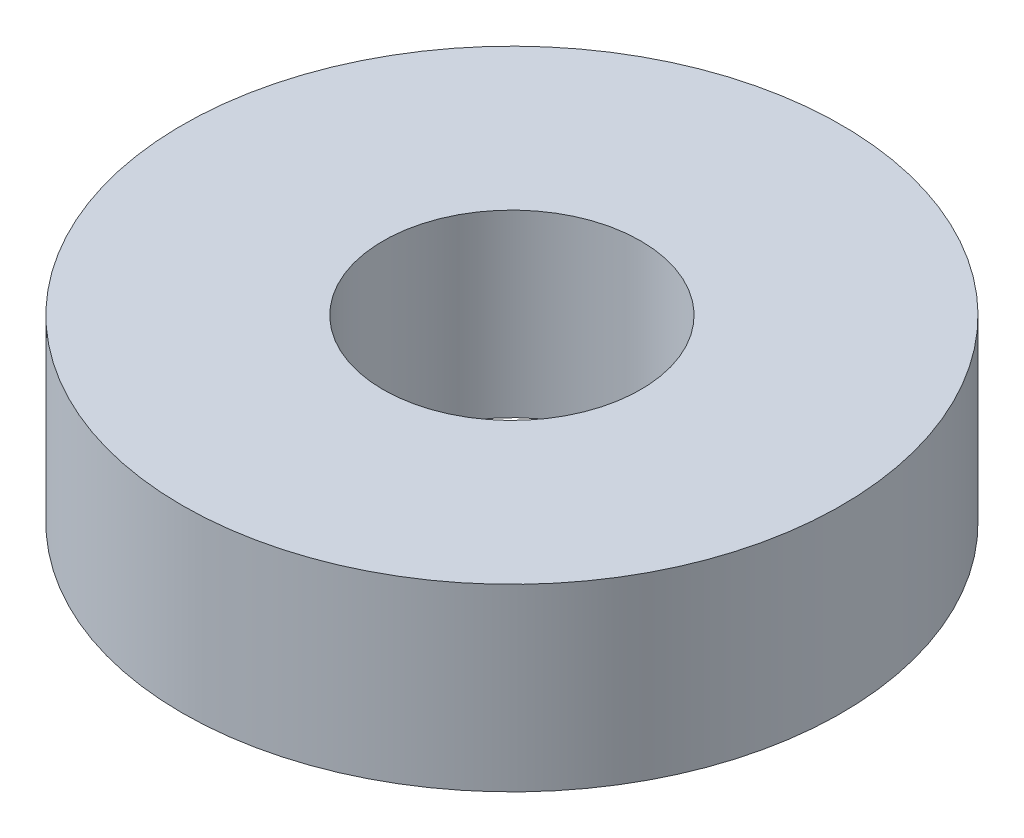
ISO-10303-21;
HEADER;
FILE_DESCRIPTION(('STEP AP214'),'2;1');
FILE_NAME('part.step','',(''),(''),'','','');
FILE_SCHEMA(('AUTOMOTIVE_DESIGN { 1 0 10303 214 1 1 1 1 }'));
ENDSEC;
DATA;
#1=APPLICATION_CONTEXT('core data for automotive mechanical design processes');
#2=APPLICATION_PROTOCOL_DEFINITION('international standard','automotive_design',2000,#1);
#3=PRODUCT_CONTEXT('',#1,'mechanical');
#4=PRODUCT('Part','Part','',(#3));
#5=PRODUCT_RELATED_PRODUCT_CATEGORY('part','',(#4));
#6=PRODUCT_DEFINITION_FORMATION('','',#4);
#7=PRODUCT_DEFINITION_CONTEXT('part definition',#1,'design');
#8=PRODUCT_DEFINITION('design','',#6,#7);
#9=PRODUCT_DEFINITION_SHAPE('','',#8);
#10=(LENGTH_UNIT() NAMED_UNIT(*) SI_UNIT(.MILLI.,.METRE.));
#11=(NAMED_UNIT(*) PLANE_ANGLE_UNIT() SI_UNIT($,.RADIAN.));
#12=(NAMED_UNIT(*) SI_UNIT($,.STERADIAN.) SOLID_ANGLE_UNIT());
#13=UNCERTAINTY_MEASURE_WITH_UNIT(LENGTH_MEASURE(1.E-05),#10,'distance_accuracy_value','');
#14=(GEOMETRIC_REPRESENTATION_CONTEXT(3) GLOBAL_UNCERTAINTY_ASSIGNED_CONTEXT((#13)) GLOBAL_UNIT_ASSIGNED_CONTEXT((#10,
#11,#12)) REPRESENTATION_CONTEXT('',''));
#15=CARTESIAN_POINT('',(0.,0.,0.));
#16=DIRECTION('',(0.,0.,1.));
#17=DIRECTION('',(1.,0.,0.));
#18=AXIS2_PLACEMENT_3D('',#15,#16,#17);
#19=CARTESIAN_POINT('',(0.,0.,0.));
#20=DIRECTION('',(0.,1.,0.));
#21=DIRECTION('',(0.,0.,1.));
#22=AXIS2_PLACEMENT_3D('',#19,#20,#21);
#23=PLANE('',#22);
#24=DIRECTION('',(0.,0.,1.));
#25=VECTOR('',#24,1.);
#26=CARTESIAN_POINT('',(1.627,0.,0.));
#27=LINE('',#26,#25);
#28=CARTESIAN_POINT('',(1.627,0.,3.423));
#29=VERTEX_POINT('',#28);
#30=CARTESIAN_POINT('',(1.627,0.,4.677));
#31=VERTEX_POINT('',#30);
#32=EDGE_CURVE('E146',#29,#31,#27,.T.);
#33=ORIENTED_EDGE('',*,*,#32,.F.);
#34=DIRECTION('',(1.,0.,0.));
#35=VECTOR('',#34,1.);
#36=CARTESIAN_POINT('',(0.,0.,3.423));
#37=LINE('',#36,#35);
#38=CARTESIAN_POINT('',(-1.627,0.,3.423));
#39=VERTEX_POINT('',#38);
#40=EDGE_CURVE('E59',#39,#29,#37,.T.);
#41=ORIENTED_EDGE('',*,*,#40,.F.);
#42=DIRECTION('',(0.,0.,1.));
#43=VECTOR('',#42,1.);
#44=CARTESIAN_POINT('',(-1.627,0.,0.));
#45=LINE('',#44,#43);
#46=CARTESIAN_POINT('',(-1.627,0.,4.677));
#47=VERTEX_POINT('',#46);
#48=EDGE_CURVE('E132',#39,#47,#45,.T.);
#49=ORIENTED_EDGE('',*,*,#48,.T.);
#50=DIRECTION('',(1.,0.,0.));
#51=VECTOR('',#50,1.);
#52=CARTESIAN_POINT('',(0.,0.,4.677));
#53=LINE('',#52,#51);
#54=EDGE_CURVE('E137',#47,#31,#53,.T.);
#55=ORIENTED_EDGE('',*,*,#54,.T.);
#56=EDGE_LOOP('',(#33,#41,#49,#55));
#57=FACE_BOUND('',#56,.T.);
#58=CARTESIAN_POINT('',(0.,0.,0.));
#59=DIRECTION('',(0.,1.,0.));
#60=DIRECTION('',(0.,0.,1.));
#61=AXIS2_PLACEMENT_3D('',#58,#59,#60);
#62=CIRCLE('',#61,5.5);
#63=CARTESIAN_POINT('',(0.,0.,5.5));
#64=VERTEX_POINT('',#63);
#65=EDGE_CURVE('E47',#64,#64,#62,.T.);
#66=ORIENTED_EDGE('',*,*,#65,.F.);
#67=EDGE_LOOP('',(#66));
#68=FACE_BOUND('',#67,.T.);
#69=CARTESIAN_POINT('',(0.,0.,0.));
#70=DIRECTION('',(0.,1.,0.));
#71=DIRECTION('',(0.,0.,1.));
#72=AXIS2_PLACEMENT_3D('',#69,#70,#71);
#73=CIRCLE('',#72,2.14999999999999);
#74=CARTESIAN_POINT('',(0.,0.,2.14999999999999));
#75=VERTEX_POINT('',#74);
#76=EDGE_CURVE('E205',#75,#75,#73,.T.);
#77=ORIENTED_EDGE('',*,*,#76,.T.);
#78=EDGE_LOOP('',(#77));
#79=FACE_BOUND('',#78,.T.);
#80=DIRECTION('',(1.,0.,0.));
#81=VECTOR('',#80,1.);
#82=CARTESIAN_POINT('',(0.,0.,-3.423));
#83=LINE('',#82,#81);
#84=CARTESIAN_POINT('',(-1.627,0.,-3.423));
#85=VERTEX_POINT('',#84);
#86=CARTESIAN_POINT('',(1.627,0.,-3.423));
#87=VERTEX_POINT('',#86);
#88=EDGE_CURVE('E67',#85,#87,#83,.T.);
#89=ORIENTED_EDGE('',*,*,#88,.T.);
#90=DIRECTION('',(0.,0.,-1.));
#91=VECTOR('',#90,1.);
#92=CARTESIAN_POINT('',(1.627,0.,0.));
#93=LINE('',#92,#91);
#94=CARTESIAN_POINT('',(1.627,0.,-4.677));
#95=VERTEX_POINT('',#94);
#96=EDGE_CURVE('E167',#87,#95,#93,.T.);
#97=ORIENTED_EDGE('',*,*,#96,.T.);
#98=DIRECTION('',(1.,0.,0.));
#99=VECTOR('',#98,1.);
#100=CARTESIAN_POINT('',(0.,0.,-4.677));
#101=LINE('',#100,#99);
#102=CARTESIAN_POINT('',(-1.627,0.,-4.677));
#103=VERTEX_POINT('',#102);
#104=EDGE_CURVE('E185',#103,#95,#101,.T.);
#105=ORIENTED_EDGE('',*,*,#104,.F.);
#106=DIRECTION('',(0.,0.,-1.));
#107=VECTOR('',#106,1.);
#108=CARTESIAN_POINT('',(-1.627,0.,0.));
#109=LINE('',#108,#107);
#110=EDGE_CURVE('E181',#85,#103,#109,.T.);
#111=ORIENTED_EDGE('',*,*,#110,.F.);
#112=EDGE_LOOP('',(#89,#97,#105,#111));
#113=FACE_BOUND('',#112,.T.);
#114=ADVANCED_FACE('F43',(#57,#68,#79,#113),#23,.F.);
#115=CARTESIAN_POINT('',(0.,3.,0.));
#116=DIRECTION('',(0.,-1.,0.));
#117=DIRECTION('',(0.,0.,-1.));
#118=AXIS2_PLACEMENT_3D('',#115,#116,#117);
#119=CYLINDRICAL_SURFACE('',#118,5.5);
#120=CARTESIAN_POINT('',(0.,3.,0.));
#121=DIRECTION('',(0.,1.,0.));
#122=DIRECTION('',(0.,0.,1.));
#123=AXIS2_PLACEMENT_3D('',#120,#121,#122);
#124=CIRCLE('',#123,5.5);
#125=CARTESIAN_POINT('',(0.,3.,5.5));
#126=VERTEX_POINT('',#125);
#127=EDGE_CURVE('E11',#126,#126,#124,.T.);
#128=ORIENTED_EDGE('',*,*,#127,.F.);
#129=EDGE_LOOP('',(#128));
#130=FACE_BOUND('',#129,.T.);
#131=ORIENTED_EDGE('',*,*,#65,.T.);
#132=EDGE_LOOP('',(#131));
#133=FACE_BOUND('',#132,.T.);
#134=ADVANCED_FACE('F45',(#130,#133),#119,.T.);
#135=CARTESIAN_POINT('',(0.,3.,0.));
#136=DIRECTION('',(0.,1.,0.));
#137=DIRECTION('',(0.,0.,1.));
#138=AXIS2_PLACEMENT_3D('',#135,#136,#137);
#139=PLANE('',#138);
#140=CARTESIAN_POINT('',(0.,3.,0.));
#141=DIRECTION('',(0.,1.,0.));
#142=DIRECTION('',(0.,0.,1.));
#143=AXIS2_PLACEMENT_3D('',#140,#141,#142);
#144=CIRCLE('',#143,2.14999999999999);
#145=CARTESIAN_POINT('',(0.,3.,2.14999999999999));
#146=VERTEX_POINT('',#145);
#147=EDGE_CURVE('E156',#146,#146,#144,.T.);
#148=ORIENTED_EDGE('',*,*,#147,.F.);
#149=EDGE_LOOP('',(#148));
#150=FACE_BOUND('',#149,.T.);
#151=ORIENTED_EDGE('',*,*,#127,.T.);
#152=EDGE_LOOP('',(#151));
#153=FACE_BOUND('',#152,.T.);
#154=ADVANCED_FACE('F251',(#150,#153),#139,.T.);
#155=CARTESIAN_POINT('',(0.,3.,0.));
#156=DIRECTION('',(0.,1.,0.));
#157=DIRECTION('',(0.,0.,1.));
#158=AXIS2_PLACEMENT_3D('',#155,#156,#157);
#159=CYLINDRICAL_SURFACE('',#158,2.14999999999999);
#160=ORIENTED_EDGE('',*,*,#76,.F.);
#161=EDGE_LOOP('',(#160));
#162=FACE_BOUND('',#161,.T.);
#163=ORIENTED_EDGE('',*,*,#147,.T.);
#164=EDGE_LOOP('',(#163));
#165=FACE_BOUND('',#164,.T.);
#166=ADVANCED_FACE('F248',(#162,#165),#159,.F.);
#167=CARTESIAN_POINT('',(0.,2.,-3.423));
#168=DIRECTION('',(0.,0.,-1.));
#169=DIRECTION('',(-1.,0.,0.));
#170=AXIS2_PLACEMENT_3D('',#167,#168,#169);
#171=PLANE('',#170);
#172=ORIENTED_EDGE('',*,*,#88,.F.);
#173=DIRECTION('',(0.,-1.,0.));
#174=VECTOR('',#173,1.);
#175=CARTESIAN_POINT('',(-1.627,2.,-3.423));
#176=LINE('',#175,#174);
#177=CARTESIAN_POINT('',(-1.627,2.,-3.423));
#178=VERTEX_POINT('',#177);
#179=EDGE_CURVE('E178',#178,#85,#176,.T.);
#180=ORIENTED_EDGE('',*,*,#179,.F.);
#181=DIRECTION('',(1.,0.,0.));
#182=VECTOR('',#181,1.);
#183=CARTESIAN_POINT('',(0.,2.,-3.423));
#184=LINE('',#183,#182);
#185=CARTESIAN_POINT('',(1.627,2.,-3.423));
#186=VERTEX_POINT('',#185);
#187=EDGE_CURVE('E162',#178,#186,#184,.T.);
#188=ORIENTED_EDGE('',*,*,#187,.T.);
#189=DIRECTION('',(0.,-1.,0.));
#190=VECTOR('',#189,1.);
#191=CARTESIAN_POINT('',(1.627,2.,-3.423));
#192=LINE('',#191,#190);
#193=EDGE_CURVE('E147',#186,#87,#192,.T.);
#194=ORIENTED_EDGE('',*,*,#193,.T.);
#195=EDGE_LOOP('',(#172,#180,#188,#194));
#196=FACE_BOUND('',#195,.T.);
#197=ADVANCED_FACE('F227',(#196),#171,.T.);
#198=CARTESIAN_POINT('',(1.627,2.,0.));
#199=DIRECTION('',(-1.,0.,0.));
#200=DIRECTION('',(0.,0.,1.));
#201=AXIS2_PLACEMENT_3D('',#198,#199,#200);
#202=PLANE('',#201);
#203=ORIENTED_EDGE('',*,*,#96,.F.);
#204=ORIENTED_EDGE('',*,*,#193,.F.);
#205=DIRECTION('',(0.,0.,-1.));
#206=VECTOR('',#205,1.);
#207=CARTESIAN_POINT('',(1.627,2.,0.));
#208=LINE('',#207,#206);
#209=CARTESIAN_POINT('',(1.627,2.,-4.677));
#210=VERTEX_POINT('',#209);
#211=EDGE_CURVE('E175',#186,#210,#208,.T.);
#212=ORIENTED_EDGE('',*,*,#211,.T.);
#213=DIRECTION('',(0.,-1.,0.));
#214=VECTOR('',#213,1.);
#215=CARTESIAN_POINT('',(1.627,2.,-4.677));
#216=LINE('',#215,#214);
#217=EDGE_CURVE('E194',#210,#95,#216,.T.);
#218=ORIENTED_EDGE('',*,*,#217,.T.);
#219=EDGE_LOOP('',(#203,#204,#212,#218));
#220=FACE_BOUND('',#219,.T.);
#221=ADVANCED_FACE('F233',(#220),#202,.T.);
#222=CARTESIAN_POINT('',(0.,2.,-4.677));
#223=DIRECTION('',(0.,0.,-1.));
#224=DIRECTION('',(-1.,0.,0.));
#225=AXIS2_PLACEMENT_3D('',#222,#223,#224);
#226=PLANE('',#225);
#227=ORIENTED_EDGE('',*,*,#104,.T.);
#228=ORIENTED_EDGE('',*,*,#217,.F.);
#229=DIRECTION('',(1.,0.,0.));
#230=VECTOR('',#229,1.);
#231=CARTESIAN_POINT('',(0.,2.,-4.677));
#232=LINE('',#231,#230);
#233=CARTESIAN_POINT('',(-1.627,2.,-4.677));
#234=VERTEX_POINT('',#233);
#235=EDGE_CURVE('E171',#234,#210,#232,.T.);
#236=ORIENTED_EDGE('',*,*,#235,.F.);
#237=DIRECTION('',(0.,-1.,0.));
#238=VECTOR('',#237,1.);
#239=CARTESIAN_POINT('',(-1.627,2.,-4.677));
#240=LINE('',#239,#238);
#241=EDGE_CURVE('E197',#234,#103,#240,.T.);
#242=ORIENTED_EDGE('',*,*,#241,.T.);
#243=EDGE_LOOP('',(#227,#228,#236,#242));
#244=FACE_BOUND('',#243,.T.);
#245=ADVANCED_FACE('F235',(#244),#226,.F.);
#246=CARTESIAN_POINT('',(-1.627,2.,0.));
#247=DIRECTION('',(-1.,0.,0.));
#248=DIRECTION('',(0.,0.,1.));
#249=AXIS2_PLACEMENT_3D('',#246,#247,#248);
#250=PLANE('',#249);
#251=ORIENTED_EDGE('',*,*,#110,.T.);
#252=ORIENTED_EDGE('',*,*,#241,.F.);
#253=DIRECTION('',(0.,0.,-1.));
#254=VECTOR('',#253,1.);
#255=CARTESIAN_POINT('',(-1.627,2.,0.));
#256=LINE('',#255,#254);
#257=EDGE_CURVE('E166',#178,#234,#256,.T.);
#258=ORIENTED_EDGE('',*,*,#257,.F.);
#259=ORIENTED_EDGE('',*,*,#179,.T.);
#260=EDGE_LOOP('',(#251,#252,#258,#259));
#261=FACE_BOUND('',#260,.T.);
#262=ADVANCED_FACE('F223',(#261),#250,.F.);
#263=CARTESIAN_POINT('',(0.,2.,0.));
#264=DIRECTION('',(0.,-1.,0.));
#265=DIRECTION('',(0.,0.,-1.));
#266=AXIS2_PLACEMENT_3D('',#263,#264,#265);
#267=PLANE('',#266);
#268=ORIENTED_EDGE('',*,*,#187,.F.);
#269=ORIENTED_EDGE('',*,*,#257,.T.);
#270=ORIENTED_EDGE('',*,*,#235,.T.);
#271=ORIENTED_EDGE('',*,*,#211,.F.);
#272=EDGE_LOOP('',(#268,#269,#270,#271));
#273=FACE_BOUND('',#272,.T.);
#274=ADVANCED_FACE('F230',(#273),#267,.T.);
#275=CARTESIAN_POINT('',(0.,2.,3.423));
#276=DIRECTION('',(0.,0.,-1.));
#277=DIRECTION('',(-1.,0.,0.));
#278=AXIS2_PLACEMENT_3D('',#275,#276,#277);
#279=PLANE('',#278);
#280=ORIENTED_EDGE('',*,*,#40,.T.);
#281=DIRECTION('',(0.,-1.,0.));
#282=VECTOR('',#281,1.);
#283=CARTESIAN_POINT('',(1.627,2.,3.423));
#284=LINE('',#283,#282);
#285=CARTESIAN_POINT('',(1.627,2.,3.423));
#286=VERTEX_POINT('',#285);
#287=EDGE_CURVE('E108',#286,#29,#284,.T.);
#288=ORIENTED_EDGE('',*,*,#287,.F.);
#289=DIRECTION('',(1.,0.,0.));
#290=VECTOR('',#289,1.);
#291=CARTESIAN_POINT('',(0.,2.,3.423));
#292=LINE('',#291,#290);
#293=CARTESIAN_POINT('',(-1.627,2.,3.423));
#294=VERTEX_POINT('',#293);
#295=EDGE_CURVE('E112',#294,#286,#292,.T.);
#296=ORIENTED_EDGE('',*,*,#295,.F.);
#297=DIRECTION('',(0.,-1.,0.));
#298=VECTOR('',#297,1.);
#299=CARTESIAN_POINT('',(-1.627,2.,3.423));
#300=LINE('',#299,#298);
#301=EDGE_CURVE('E153',#294,#39,#300,.T.);
#302=ORIENTED_EDGE('',*,*,#301,.T.);
#303=EDGE_LOOP('',(#280,#288,#296,#302));
#304=FACE_BOUND('',#303,.T.);
#305=ADVANCED_FACE('F110',(#304),#279,.F.);
#306=CARTESIAN_POINT('',(-1.627,2.,0.));
#307=DIRECTION('',(1.,0.,0.));
#308=DIRECTION('',(0.,0.,-1.));
#309=AXIS2_PLACEMENT_3D('',#306,#307,#308);
#310=PLANE('',#309);
#311=ORIENTED_EDGE('',*,*,#48,.F.);
#312=ORIENTED_EDGE('',*,*,#301,.F.);
#313=DIRECTION('',(0.,0.,1.));
#314=VECTOR('',#313,1.);
#315=CARTESIAN_POINT('',(-1.627,2.,0.));
#316=LINE('',#315,#314);
#317=CARTESIAN_POINT('',(-1.627,2.,4.677));
#318=VERTEX_POINT('',#317);
#319=EDGE_CURVE('E118',#294,#318,#316,.T.);
#320=ORIENTED_EDGE('',*,*,#319,.T.);
#321=DIRECTION('',(0.,-1.,0.));
#322=VECTOR('',#321,1.);
#323=CARTESIAN_POINT('',(-1.627,2.,4.677));
#324=LINE('',#323,#322);
#325=EDGE_CURVE('E157',#318,#47,#324,.T.);
#326=ORIENTED_EDGE('',*,*,#325,.T.);
#327=EDGE_LOOP('',(#311,#312,#320,#326));
#328=FACE_BOUND('',#327,.T.);
#329=ADVANCED_FACE('F310',(#328),#310,.T.);
#330=CARTESIAN_POINT('',(0.,2.,4.677));
#331=DIRECTION('',(0.,0.,-1.));
#332=DIRECTION('',(-1.,0.,0.));
#333=AXIS2_PLACEMENT_3D('',#330,#331,#332);
#334=PLANE('',#333);
#335=ORIENTED_EDGE('',*,*,#54,.F.);
#336=ORIENTED_EDGE('',*,*,#325,.F.);
#337=DIRECTION('',(1.,0.,0.));
#338=VECTOR('',#337,1.);
#339=CARTESIAN_POINT('',(0.,2.,4.677));
#340=LINE('',#339,#338);
#341=CARTESIAN_POINT('',(1.627,2.,4.677));
#342=VERTEX_POINT('',#341);
#343=EDGE_CURVE('E127',#318,#342,#340,.T.);
#344=ORIENTED_EDGE('',*,*,#343,.T.);
#345=DIRECTION('',(0.,-1.,0.));
#346=VECTOR('',#345,1.);
#347=CARTESIAN_POINT('',(1.627,2.,4.677));
#348=LINE('',#347,#346);
#349=EDGE_CURVE('E117',#342,#31,#348,.T.);
#350=ORIENTED_EDGE('',*,*,#349,.T.);
#351=EDGE_LOOP('',(#335,#336,#344,#350));
#352=FACE_BOUND('',#351,.T.);
#353=ADVANCED_FACE('F319',(#352),#334,.T.);
#354=CARTESIAN_POINT('',(1.627,2.,0.));
#355=DIRECTION('',(1.,0.,0.));
#356=DIRECTION('',(0.,0.,-1.));
#357=AXIS2_PLACEMENT_3D('',#354,#355,#356);
#358=PLANE('',#357);
#359=ORIENTED_EDGE('',*,*,#32,.T.);
#360=ORIENTED_EDGE('',*,*,#349,.F.);
#361=DIRECTION('',(0.,0.,1.));
#362=VECTOR('',#361,1.);
#363=CARTESIAN_POINT('',(1.627,2.,0.));
#364=LINE('',#363,#362);
#365=EDGE_CURVE('E122',#286,#342,#364,.T.);
#366=ORIENTED_EDGE('',*,*,#365,.F.);
#367=ORIENTED_EDGE('',*,*,#287,.T.);
#368=EDGE_LOOP('',(#359,#360,#366,#367));
#369=FACE_BOUND('',#368,.T.);
#370=ADVANCED_FACE('F123',(#369),#358,.F.);
#371=CARTESIAN_POINT('',(0.,2.,0.));
#372=DIRECTION('',(0.,-1.,0.));
#373=DIRECTION('',(0.,0.,-1.));
#374=AXIS2_PLACEMENT_3D('',#371,#372,#373);
#375=PLANE('',#374);
#376=ORIENTED_EDGE('',*,*,#295,.T.);
#377=ORIENTED_EDGE('',*,*,#365,.T.);
#378=ORIENTED_EDGE('',*,*,#343,.F.);
#379=ORIENTED_EDGE('',*,*,#319,.F.);
#380=EDGE_LOOP('',(#376,#377,#378,#379));
#381=FACE_BOUND('',#380,.T.);
#382=ADVANCED_FACE('F130',(#381),#375,.T.);
#383=CLOSED_SHELL('',(#114,#134,#154,#166,#197,#221,#245,#262,#274,#305,#329,#353,#370,#382));
#384=MANIFOLD_SOLID_BREP('B2',#383);
#385=ADVANCED_BREP_SHAPE_REPRESENTATION('',(#18,#384),#14);
#386=SHAPE_DEFINITION_REPRESENTATION(#9,#385);
ENDSEC;
END-ISO-10303-21;
